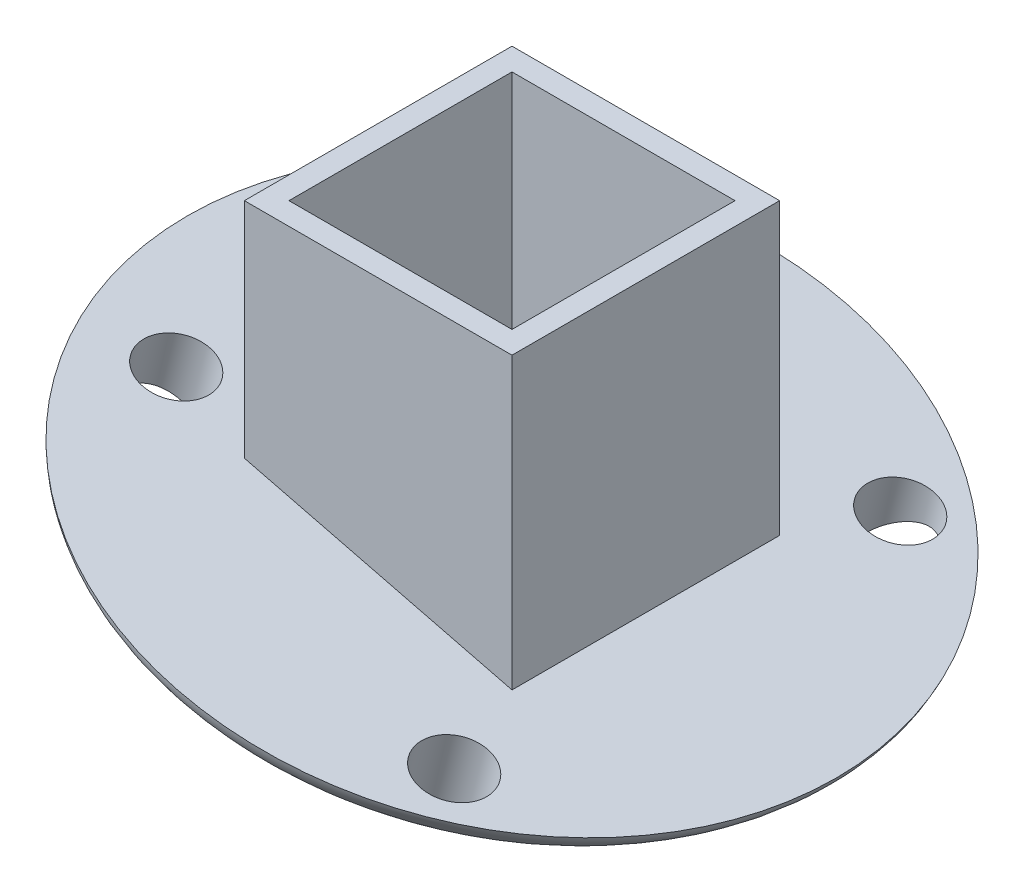
ISO-10303-21;
HEADER;
FILE_DESCRIPTION(('STEP AP214'),'2;1');
FILE_NAME('part.step','',(''),(''),'','','');
FILE_SCHEMA(('AUTOMOTIVE_DESIGN { 1 0 10303 214 1 1 1 1 }'));
ENDSEC;
DATA;
#1=APPLICATION_CONTEXT('core data for automotive mechanical design processes');
#2=APPLICATION_PROTOCOL_DEFINITION('international standard','automotive_design',2000,#1);
#3=PRODUCT_CONTEXT('',#1,'mechanical');
#4=PRODUCT('Part','Part','',(#3));
#5=PRODUCT_RELATED_PRODUCT_CATEGORY('part','',(#4));
#6=PRODUCT_DEFINITION_FORMATION('','',#4);
#7=PRODUCT_DEFINITION_CONTEXT('part definition',#1,'design');
#8=PRODUCT_DEFINITION('design','',#6,#7);
#9=PRODUCT_DEFINITION_SHAPE('','',#8);
#10=(LENGTH_UNIT() NAMED_UNIT(*) SI_UNIT(.MILLI.,.METRE.));
#11=(NAMED_UNIT(*) PLANE_ANGLE_UNIT() SI_UNIT($,.RADIAN.));
#12=(NAMED_UNIT(*) SI_UNIT($,.STERADIAN.) SOLID_ANGLE_UNIT());
#13=UNCERTAINTY_MEASURE_WITH_UNIT(LENGTH_MEASURE(1.E-05),#10,'distance_accuracy_value','');
#14=(GEOMETRIC_REPRESENTATION_CONTEXT(3) GLOBAL_UNCERTAINTY_ASSIGNED_CONTEXT((#13)) GLOBAL_UNIT_ASSIGNED_CONTEXT((#10,
#11,#12)) REPRESENTATION_CONTEXT('',''));
#15=CARTESIAN_POINT('',(0.,0.,0.));
#16=DIRECTION('',(0.,0.,1.));
#17=DIRECTION('',(1.,0.,0.));
#18=AXIS2_PLACEMENT_3D('',#15,#16,#17);
#19=CARTESIAN_POINT('',(-6.,10.,-6.));
#20=DIRECTION('',(0.,0.,1.));
#21=DIRECTION('',(1.,0.,0.));
#22=AXIS2_PLACEMENT_3D('',#19,#20,#21);
#23=PLANE('',#22);
#24=DIRECTION('',(0.970142500145332,-0.242535625036333,0.));
#25=VECTOR('',#24,1.);
#26=CARTESIAN_POINT('',(-0.352941176470588,-1.41176470588235,-6.));
#27=LINE('',#26,#25);
#28=CARTESIAN_POINT('',(-6.,0.,-6.));
#29=VERTEX_POINT('',#28);
#30=CARTESIAN_POINT('',(6.,-3.,-6.));
#31=VERTEX_POINT('',#30);
#32=EDGE_CURVE('E297',#29,#31,#27,.T.);
#33=ORIENTED_EDGE('',*,*,#32,.F.);
#34=DIRECTION('',(0.,-1.,0.));
#35=VECTOR('',#34,1.);
#36=CARTESIAN_POINT('',(-6.,10.,-6.));
#37=LINE('',#36,#35);
#38=CARTESIAN_POINT('',(-6.,10.,-6.));
#39=VERTEX_POINT('',#38);
#40=EDGE_CURVE('E56',#39,#29,#37,.T.);
#41=ORIENTED_EDGE('',*,*,#40,.F.);
#42=DIRECTION('',(-1.,0.,0.));
#43=VECTOR('',#42,1.);
#44=CARTESIAN_POINT('',(-6.,10.,-6.));
#45=LINE('',#44,#43);
#46=CARTESIAN_POINT('',(6.,10.,-6.));
#47=VERTEX_POINT('',#46);
#48=EDGE_CURVE('E207',#47,#39,#45,.T.);
#49=ORIENTED_EDGE('',*,*,#48,.F.);
#50=DIRECTION('',(0.,-1.,0.));
#51=VECTOR('',#50,1.);
#52=CARTESIAN_POINT('',(6.,10.,-6.));
#53=LINE('',#52,#51);
#54=EDGE_CURVE('E11',#47,#31,#53,.T.);
#55=ORIENTED_EDGE('',*,*,#54,.T.);
#56=EDGE_LOOP('',(#33,#41,#49,#55));
#57=FACE_BOUND('',#56,.T.);
#58=ADVANCED_FACE('F41',(#57),#23,.F.);
#59=CARTESIAN_POINT('',(-6.,10.,-6.));
#60=DIRECTION('',(1.,0.,0.));
#61=DIRECTION('',(0.,0.,-1.));
#62=AXIS2_PLACEMENT_3D('',#59,#60,#61);
#63=PLANE('',#62);
#64=DIRECTION('',(0.,0.,1.));
#65=VECTOR('',#64,1.);
#66=CARTESIAN_POINT('',(-6.,0.,-6.));
#67=LINE('',#66,#65);
#68=CARTESIAN_POINT('',(-6.,0.,6.));
#69=VERTEX_POINT('',#68);
#70=EDGE_CURVE('E300',#29,#69,#67,.T.);
#71=ORIENTED_EDGE('',*,*,#70,.T.);
#72=DIRECTION('',(0.,-1.,0.));
#73=VECTOR('',#72,1.);
#74=CARTESIAN_POINT('',(-6.,10.,6.));
#75=LINE('',#74,#73);
#76=CARTESIAN_POINT('',(-6.,10.,6.));
#77=VERTEX_POINT('',#76);
#78=EDGE_CURVE('E219',#77,#69,#75,.T.);
#79=ORIENTED_EDGE('',*,*,#78,.F.);
#80=DIRECTION('',(0.,0.,1.));
#81=VECTOR('',#80,1.);
#82=CARTESIAN_POINT('',(-6.,10.,-6.));
#83=LINE('',#82,#81);
#84=EDGE_CURVE('E210',#39,#77,#83,.T.);
#85=ORIENTED_EDGE('',*,*,#84,.F.);
#86=ORIENTED_EDGE('',*,*,#40,.T.);
#87=EDGE_LOOP('',(#71,#79,#85,#86));
#88=FACE_BOUND('',#87,.T.);
#89=ADVANCED_FACE('F137',(#88),#63,.F.);
#90=CARTESIAN_POINT('',(-6.,10.,6.));
#91=DIRECTION('',(0.,0.,-1.));
#92=DIRECTION('',(-1.,0.,0.));
#93=AXIS2_PLACEMENT_3D('',#90,#91,#92);
#94=PLANE('',#93);
#95=DIRECTION('',(0.970142500145332,-0.242535625036333,0.));
#96=VECTOR('',#95,1.);
#97=CARTESIAN_POINT('',(-0.352941176470588,-1.41176470588235,6.));
#98=LINE('',#97,#96);
#99=CARTESIAN_POINT('',(6.,-3.,6.));
#100=VERTEX_POINT('',#99);
#101=EDGE_CURVE('E296',#69,#100,#98,.T.);
#102=ORIENTED_EDGE('',*,*,#101,.T.);
#103=DIRECTION('',(0.,-1.,0.));
#104=VECTOR('',#103,1.);
#105=CARTESIAN_POINT('',(6.,10.,6.));
#106=LINE('',#105,#104);
#107=CARTESIAN_POINT('',(6.,10.,6.));
#108=VERTEX_POINT('',#107);
#109=EDGE_CURVE('E215',#108,#100,#106,.T.);
#110=ORIENTED_EDGE('',*,*,#109,.F.);
#111=DIRECTION('',(1.,0.,0.));
#112=VECTOR('',#111,1.);
#113=CARTESIAN_POINT('',(-6.,10.,6.));
#114=LINE('',#113,#112);
#115=EDGE_CURVE('E72',#77,#108,#114,.T.);
#116=ORIENTED_EDGE('',*,*,#115,.F.);
#117=ORIENTED_EDGE('',*,*,#78,.T.);
#118=EDGE_LOOP('',(#102,#110,#116,#117));
#119=FACE_BOUND('',#118,.T.);
#120=ADVANCED_FACE('F142',(#119),#94,.F.);
#121=CARTESIAN_POINT('',(0.,10.,0.));
#122=DIRECTION('',(0.,1.,0.));
#123=DIRECTION('',(0.,0.,1.));
#124=AXIS2_PLACEMENT_3D('',#121,#122,#123);
#125=PLANE('',#124);
#126=DIRECTION('',(0.,0.,-1.));
#127=VECTOR('',#126,1.);
#128=CARTESIAN_POINT('',(6.,10.,-6.));
#129=LINE('',#128,#127);
#130=EDGE_CURVE('E204',#108,#47,#129,.T.);
#131=ORIENTED_EDGE('',*,*,#130,.T.);
#132=ORIENTED_EDGE('',*,*,#48,.T.);
#133=ORIENTED_EDGE('',*,*,#84,.T.);
#134=ORIENTED_EDGE('',*,*,#115,.T.);
#135=EDGE_LOOP('',(#131,#132,#133,#134));
#136=FACE_BOUND('',#135,.T.);
#137=DIRECTION('',(-1.,0.,0.));
#138=VECTOR('',#137,1.);
#139=CARTESIAN_POINT('',(-5.00000000000001,10.,-5.));
#140=LINE('',#139,#138);
#141=CARTESIAN_POINT('',(5.,10.,-5.));
#142=VERTEX_POINT('',#141);
#143=CARTESIAN_POINT('',(-5.00000000000001,10.,-5.));
#144=VERTEX_POINT('',#143);
#145=EDGE_CURVE('E185',#142,#144,#140,.T.);
#146=ORIENTED_EDGE('',*,*,#145,.F.);
#147=DIRECTION('',(0.,0.,-1.));
#148=VECTOR('',#147,1.);
#149=CARTESIAN_POINT('',(5.,10.,5.));
#150=LINE('',#149,#148);
#151=CARTESIAN_POINT('',(5.,10.,5.));
#152=VERTEX_POINT('',#151);
#153=EDGE_CURVE('E181',#152,#142,#150,.T.);
#154=ORIENTED_EDGE('',*,*,#153,.F.);
#155=DIRECTION('',(1.,0.,0.));
#156=VECTOR('',#155,1.);
#157=CARTESIAN_POINT('',(-5.00000000000001,10.,5.));
#158=LINE('',#157,#156);
#159=CARTESIAN_POINT('',(-5.00000000000001,10.,5.));
#160=VERTEX_POINT('',#159);
#161=EDGE_CURVE('E194',#160,#152,#158,.T.);
#162=ORIENTED_EDGE('',*,*,#161,.F.);
#163=DIRECTION('',(0.,0.,1.));
#164=VECTOR('',#163,1.);
#165=CARTESIAN_POINT('',(-5.00000000000001,10.,5.));
#166=LINE('',#165,#164);
#167=EDGE_CURVE('E313',#144,#160,#166,.T.);
#168=ORIENTED_EDGE('',*,*,#167,.F.);
#169=EDGE_LOOP('',(#146,#154,#162,#168));
#170=FACE_BOUND('',#169,.T.);
#171=ADVANCED_FACE('F149',(#136,#170),#125,.T.);
#172=CARTESIAN_POINT('',(6.,10.,-6.));
#173=DIRECTION('',(-1.,0.,0.));
#174=DIRECTION('',(0.,0.,1.));
#175=AXIS2_PLACEMENT_3D('',#172,#173,#174);
#176=PLANE('',#175);
#177=ORIENTED_EDGE('',*,*,#109,.T.);
#178=DIRECTION('',(0.,0.,-1.));
#179=VECTOR('',#178,1.);
#180=CARTESIAN_POINT('',(6.,-3.,-6.));
#181=LINE('',#180,#179);
#182=EDGE_CURVE('E307',#100,#31,#181,.T.);
#183=ORIENTED_EDGE('',*,*,#182,.T.);
#184=ORIENTED_EDGE('',*,*,#54,.F.);
#185=ORIENTED_EDGE('',*,*,#130,.F.);
#186=EDGE_LOOP('',(#177,#183,#184,#185));
#187=FACE_BOUND('',#186,.T.);
#188=ADVANCED_FACE('F43',(#187),#176,.F.);
#189=CARTESIAN_POINT('',(5.,10.,5.));
#190=DIRECTION('',(-1.,0.,0.));
#191=DIRECTION('',(0.,0.,1.));
#192=AXIS2_PLACEMENT_3D('',#189,#190,#191);
#193=PLANE('',#192);
#194=DIRECTION('',(0.,0.,-1.));
#195=VECTOR('',#194,1.);
#196=CARTESIAN_POINT('',(5.,0.,5.));
#197=LINE('',#196,#195);
#198=CARTESIAN_POINT('',(5.,0.,5.));
#199=VERTEX_POINT('',#198);
#200=CARTESIAN_POINT('',(5.,0.,-5.));
#201=VERTEX_POINT('',#200);
#202=EDGE_CURVE('E177',#199,#201,#197,.T.);
#203=ORIENTED_EDGE('',*,*,#202,.F.);
#204=DIRECTION('',(0.,-1.,0.));
#205=VECTOR('',#204,1.);
#206=CARTESIAN_POINT('',(5.,10.,5.));
#207=LINE('',#206,#205);
#208=EDGE_CURVE('E191',#152,#199,#207,.T.);
#209=ORIENTED_EDGE('',*,*,#208,.F.);
#210=ORIENTED_EDGE('',*,*,#153,.T.);
#211=DIRECTION('',(0.,-1.,0.));
#212=VECTOR('',#211,1.);
#213=CARTESIAN_POINT('',(5.,10.,-5.));
#214=LINE('',#213,#212);
#215=EDGE_CURVE('E200',#142,#201,#214,.T.);
#216=ORIENTED_EDGE('',*,*,#215,.T.);
#217=EDGE_LOOP('',(#203,#209,#210,#216));
#218=FACE_BOUND('',#217,.T.);
#219=ADVANCED_FACE('F153',(#218),#193,.T.);
#220=CARTESIAN_POINT('',(-5.00000000000001,10.,-5.));
#221=DIRECTION('',(0.,0.,1.));
#222=DIRECTION('',(1.,0.,0.));
#223=AXIS2_PLACEMENT_3D('',#220,#221,#222);
#224=PLANE('',#223);
#225=DIRECTION('',(-1.,0.,0.));
#226=VECTOR('',#225,1.);
#227=CARTESIAN_POINT('',(-5.00000000000001,0.,-5.));
#228=LINE('',#227,#226);
#229=CARTESIAN_POINT('',(-5.00000000000001,0.,-5.));
#230=VERTEX_POINT('',#229);
#231=EDGE_CURVE('E187',#201,#230,#228,.T.);
#232=ORIENTED_EDGE('',*,*,#231,.F.);
#233=ORIENTED_EDGE('',*,*,#215,.F.);
#234=ORIENTED_EDGE('',*,*,#145,.T.);
#235=DIRECTION('',(0.,-1.,0.));
#236=VECTOR('',#235,1.);
#237=CARTESIAN_POINT('',(-5.00000000000001,10.,-5.));
#238=LINE('',#237,#236);
#239=EDGE_CURVE('E197',#144,#230,#238,.T.);
#240=ORIENTED_EDGE('',*,*,#239,.T.);
#241=EDGE_LOOP('',(#232,#233,#234,#240));
#242=FACE_BOUND('',#241,.T.);
#243=ADVANCED_FACE('F156',(#242),#224,.T.);
#244=CARTESIAN_POINT('',(-5.00000000000001,10.,5.));
#245=DIRECTION('',(1.,0.,0.));
#246=DIRECTION('',(0.,0.,-1.));
#247=AXIS2_PLACEMENT_3D('',#244,#245,#246);
#248=PLANE('',#247);
#249=DIRECTION('',(0.,0.,1.));
#250=VECTOR('',#249,1.);
#251=CARTESIAN_POINT('',(-5.00000000000001,0.,5.));
#252=LINE('',#251,#250);
#253=CARTESIAN_POINT('',(-5.00000000000001,0.,5.));
#254=VERTEX_POINT('',#253);
#255=EDGE_CURVE('E179',#230,#254,#252,.T.);
#256=ORIENTED_EDGE('',*,*,#255,.F.);
#257=ORIENTED_EDGE('',*,*,#239,.F.);
#258=ORIENTED_EDGE('',*,*,#167,.T.);
#259=DIRECTION('',(0.,-1.,0.));
#260=VECTOR('',#259,1.);
#261=CARTESIAN_POINT('',(-5.00000000000001,10.,5.));
#262=LINE('',#261,#260);
#263=EDGE_CURVE('E64',#160,#254,#262,.T.);
#264=ORIENTED_EDGE('',*,*,#263,.T.);
#265=EDGE_LOOP('',(#256,#257,#258,#264));
#266=FACE_BOUND('',#265,.T.);
#267=ADVANCED_FACE('F160',(#266),#248,.T.);
#268=CARTESIAN_POINT('',(-5.00000000000001,10.,5.));
#269=DIRECTION('',(0.,0.,-1.));
#270=DIRECTION('',(-1.,0.,0.));
#271=AXIS2_PLACEMENT_3D('',#268,#269,#270);
#272=PLANE('',#271);
#273=DIRECTION('',(1.,0.,0.));
#274=VECTOR('',#273,1.);
#275=CARTESIAN_POINT('',(-5.00000000000001,0.,5.));
#276=LINE('',#275,#274);
#277=EDGE_CURVE('E174',#254,#199,#276,.T.);
#278=ORIENTED_EDGE('',*,*,#277,.F.);
#279=ORIENTED_EDGE('',*,*,#263,.F.);
#280=ORIENTED_EDGE('',*,*,#161,.T.);
#281=ORIENTED_EDGE('',*,*,#208,.T.);
#282=EDGE_LOOP('',(#278,#279,#280,#281));
#283=FACE_BOUND('',#282,.T.);
#284=ADVANCED_FACE('F164',(#283),#272,.T.);
#285=CARTESIAN_POINT('',(-6.,0.,6.));
#286=DIRECTION('',(0.,1.,0.));
#287=DIRECTION('',(0.,0.,1.));
#288=AXIS2_PLACEMENT_3D('',#285,#286,#287);
#289=PLANE('',#288);
#290=ORIENTED_EDGE('',*,*,#277,.T.);
#291=ORIENTED_EDGE('',*,*,#202,.T.);
#292=ORIENTED_EDGE('',*,*,#231,.T.);
#293=ORIENTED_EDGE('',*,*,#255,.T.);
#294=EDGE_LOOP('',(#290,#291,#292,#293));
#295=FACE_BOUND('',#294,.T.);
#296=ADVANCED_FACE('F128',(#295),#289,.T.);
#297=CARTESIAN_POINT('',(-0.352941176470588,-1.41176470588235,0.));
#298=DIRECTION('',(0.242535625036333,0.970142500145332,0.));
#299=DIRECTION('',(-0.970142500145332,0.242535625036333,0.));
#300=AXIS2_PLACEMENT_3D('',#297,#298,#299);
#301=PLANE('',#300);
#302=CARTESIAN_POINT('',(-10.0543661779239,1.01359154448097,5.));
#303=DIRECTION('',(0.242535625036333,0.970142500145332,0.));
#304=DIRECTION('',(-0.970142500145332,0.242535625036333,0.));
#305=AXIS2_PLACEMENT_3D('',#302,#303,#304);
#306=CIRCLE('',#305,1.5);
#307=CARTESIAN_POINT('',(-11.5095799281419,1.37739498203547,5.));
#308=VERTEX_POINT('',#307);
#309=EDGE_CURVE('E281',#308,#308,#306,.T.);
#310=ORIENTED_EDGE('',*,*,#309,.F.);
#311=EDGE_LOOP('',(#310));
#312=FACE_BOUND('',#311,.T.);
#313=CARTESIAN_POINT('',(7.40819882469207,-3.35204970617302,10.));
#314=DIRECTION('',(0.242535625036333,0.970142500145332,0.));
#315=DIRECTION('',(-0.970142500145332,0.242535625036333,0.));
#316=AXIS2_PLACEMENT_3D('',#313,#314,#315);
#317=CIRCLE('',#316,1.5);
#318=CARTESIAN_POINT('',(5.95298507447407,-2.98824626861852,10.));
#319=VERTEX_POINT('',#318);
#320=EDGE_CURVE('E274',#319,#319,#317,.T.);
#321=ORIENTED_EDGE('',*,*,#320,.F.);
#322=EDGE_LOOP('',(#321));
#323=FACE_BOUND('',#322,.T.);
#324=CARTESIAN_POINT('',(7.40819882469207,-3.35204970617302,-10.));
#325=DIRECTION('',(0.242535625036333,0.970142500145332,0.));
#326=DIRECTION('',(-0.970142500145332,0.242535625036333,0.));
#327=AXIS2_PLACEMENT_3D('',#324,#325,#326);
#328=CIRCLE('',#327,1.5);
#329=CARTESIAN_POINT('',(5.95298507447407,-2.98824626861852,-10.));
#330=VERTEX_POINT('',#329);
#331=EDGE_CURVE('E271',#330,#330,#328,.T.);
#332=ORIENTED_EDGE('',*,*,#331,.F.);
#333=EDGE_LOOP('',(#332));
#334=FACE_BOUND('',#333,.T.);
#335=CARTESIAN_POINT('',(-10.0543661779239,1.01359154448097,-5.));
#336=DIRECTION('',(0.242535625036333,0.970142500145332,0.));
#337=DIRECTION('',(-0.970142500145332,0.242535625036333,0.));
#338=AXIS2_PLACEMENT_3D('',#335,#336,#337);
#339=CIRCLE('',#338,1.5);
#340=CARTESIAN_POINT('',(-11.5095799281419,1.37739498203547,-5.));
#341=VERTEX_POINT('',#340);
#342=EDGE_CURVE('E234',#341,#341,#339,.T.);
#343=ORIENTED_EDGE('',*,*,#342,.F.);
#344=EDGE_LOOP('',(#343));
#345=FACE_BOUND('',#344,.T.);
#346=CARTESIAN_POINT('',(0.,-1.5,0.));
#347=DIRECTION('',(0.242535625036333,0.970142500145332,0.));
#348=DIRECTION('',(-0.970142500145332,0.242535625036333,0.));
#349=AXIS2_PLACEMENT_3D('',#346,#347,#348);
#350=CIRCLE('',#349,15.);
#351=CARTESIAN_POINT('',(-14.55213750218,2.13803437554499,0.));
#352=VERTEX_POINT('',#351);
#353=EDGE_CURVE('E259',#352,#352,#350,.T.);
#354=ORIENTED_EDGE('',*,*,#353,.T.);
#355=EDGE_LOOP('',(#354));
#356=FACE_BOUND('',#355,.T.);
#357=ORIENTED_EDGE('',*,*,#32,.T.);
#358=ORIENTED_EDGE('',*,*,#182,.F.);
#359=ORIENTED_EDGE('',*,*,#101,.F.);
#360=ORIENTED_EDGE('',*,*,#70,.F.);
#361=EDGE_LOOP('',(#357,#358,#359,#360));
#362=FACE_BOUND('',#361,.T.);
#363=ADVANCED_FACE('F119',(#312,#323,#334,#345,#356,#362),#301,.T.);
#364=CARTESIAN_POINT('',(-1.21267812518167,-6.35071250072666,0.));
#365=CARTESIAN_POINT('',(4.87585189508166,-8.18182814171305,0.));
#366=CARTESIAN_POINT('',(13.570451870267,-7.28992498295824,0.));
#367=CARTESIAN_POINT('',(14.55213750218,-5.13803437554499,0.));
#368=B_SPLINE_CURVE_WITH_KNOTS('',3,(#364,#365,#366,#367),.UNSPECIFIED.,.F.,.F.,(4,4),(0.,1.),.UNSPECIFIED.);
#369=CARTESIAN_POINT('',(0.,-1.5,0.));
#370=DIRECTION('',(0.242535625036333,0.970142500145332,0.));
#371=AXIS1_PLACEMENT('',#369,#370);
#372=SURFACE_OF_REVOLUTION('',#368,#371);
#373=CARTESIAN_POINT('',(-12.0197971199061,-0.663473785021444,5.));
#374=CARTESIAN_POINT('',(-12.0157409134766,-0.647255514687904,5.0754276182354));
#375=CARTESIAN_POINT('',(-12.0067309112504,-0.634737017285245,5.15141320809814));
#376=CARTESIAN_POINT('',(-11.9786925911136,-0.617917156391617,5.30247510571023));
#377=CARTESIAN_POINT('',(-11.959662666126,-0.613617111555374,5.37755126562121));
#378=CARTESIAN_POINT('',(-11.9118599324409,-0.613706292625446,5.52469897103323));
#379=CARTESIAN_POINT('',(-11.8830695737425,-0.61811124015603,5.59676483976878));
#380=CARTESIAN_POINT('',(-11.8165622331768,-0.635623656224439,5.73550893605356));
#381=CARTESIAN_POINT('',(-11.7788463553641,-0.648730048786384,5.80218782858519));
#382=CARTESIAN_POINT('',(-11.6970137588876,-0.68255874924934,5.92624572134935));
#383=CARTESIAN_POINT('',(-11.6531334456891,-0.703030696672179,5.98384996156558));
#384=CARTESIAN_POINT('',(-11.5594734782035,-0.750758344724975,6.09084693530998));
#385=CARTESIAN_POINT('',(-11.5096929928724,-0.778015001582919,6.14023850971779));
#386=CARTESIAN_POINT('',(-11.4035186670139,-0.839456002781774,6.2317280988319));
#387=CARTESIAN_POINT('',(-11.3469389565921,-0.873875629196584,6.27345109966863));
#388=CARTESIAN_POINT('',(-11.2303904668409,-0.947624818698004,6.34650492298712));
#389=CARTESIAN_POINT('',(-11.1704205262161,-0.986956069867339,6.37783215893063));
#390=CARTESIAN_POINT('',(-11.042717741358,-1.07318748532655,6.43233157230094));
#391=CARTESIAN_POINT('',(-10.9747853725382,-1.12045161083837,6.45445919249957));
#392=CARTESIAN_POINT('',(-10.8380051593135,-1.2180238835639,6.48607584578689));
#393=CARTESIAN_POINT('',(-10.7691557268284,-1.26833805826586,6.49553893987472));
#394=CARTESIAN_POINT('',(-10.6252802826567,-1.37574907488373,6.50229054453039));
#395=CARTESIAN_POINT('',(-10.5503229945923,-1.43302195285605,6.49827088909063));
#396=CARTESIAN_POINT('',(-10.4031543969174,-1.54795271033081,6.47559350450102));
#397=CARTESIAN_POINT('',(-10.3309397306771,-1.60561001055235,6.45695431565466));
#398=CARTESIAN_POINT('',(-10.1863538506627,-1.72367928336796,6.40399505335354));
#399=CARTESIAN_POINT('',(-10.1142717682697,-1.78402967796606,6.36874285152198));
#400=CARTESIAN_POINT('',(-9.97712355771016,-1.90205293983172,6.28324172550525));
#401=CARTESIAN_POINT('',(-9.91205850914628,-1.95972539431094,6.23299049811984));
#402=CARTESIAN_POINT('',(-9.79062070450129,-2.07116963930879,6.11825968134843));
#403=CARTESIAN_POINT('',(-9.73430994639105,-2.12491229636856,6.05368582994542));
#404=CARTESIAN_POINT('',(-9.63306491747079,-2.22639537260772,5.91206721404537));
#405=CARTESIAN_POINT('',(-9.58812839420328,-2.27413697924033,5.83502492365465));
#406=CARTESIAN_POINT('',(-9.51352198334025,-2.3598493667483,5.67445471725674));
#407=CARTESIAN_POINT('',(-9.4832293561614,-2.39817605067882,5.59140739391477));
#408=CARTESIAN_POINT('',(-9.43650041048285,-2.46639985705878,5.41823637867144));
#409=CARTESIAN_POINT('',(-9.42005680907142,-2.49630140459791,5.32811643340675));
#410=CARTESIAN_POINT('',(-9.40299933024736,-2.54437772891947,5.15103467642446));
#411=CARTESIAN_POINT('',(-9.40123975708203,-2.56329112538942,5.06438394790445));
#412=CARTESIAN_POINT('',(-9.41113271516632,-2.59199431796591,4.89033895394333));
#413=CARTESIAN_POINT('',(-9.42277798519613,-2.60178904833252,4.80294511647802));
#414=CARTESIAN_POINT('',(-9.4580745780455,-2.61135753848754,4.63694488194975));
#415=CARTESIAN_POINT('',(-9.4807578321626,-2.6118290874071,4.5581716822317));
#416=CARTESIAN_POINT('',(-9.537039345872,-2.60442052534749,4.40504808075806));
#417=CARTESIAN_POINT('',(-9.57063442229262,-2.59654284847039,4.33069639664259));
#418=CARTESIAN_POINT('',(-9.64614747732877,-2.57315973436023,4.19159312171));
#419=CARTESIAN_POINT('',(-9.68767643769283,-2.55797377358743,4.12657571428489));
#420=CARTESIAN_POINT('',(-9.7785488469761,-2.52062887177609,4.00450476349183));
#421=CARTESIAN_POINT('',(-9.82789214970185,-2.49847006118041,3.94745107117347));
#422=CARTESIAN_POINT('',(-9.93326122269951,-2.4477059266176,3.84229280242725));
#423=CARTESIAN_POINT('',(-9.98933453734701,-2.41905329294657,3.79425888616038));
#424=CARTESIAN_POINT('',(-10.1061845559403,-2.356283017037,3.708638456234));
#425=CARTESIAN_POINT('',(-10.166962098606,-2.32216439909918,3.6710538110923));
#426=CARTESIAN_POINT('',(-10.2945996845576,-2.2476327931858,3.60531170886793));
#427=CARTESIAN_POINT('',(-10.3616118573189,-2.20699295826661,3.57770794510115));
#428=CARTESIAN_POINT('',(-10.4971134767886,-2.12187573358777,3.53482697513257));
#429=CARTESIAN_POINT('',(-10.5656033573521,-2.07739720496402,3.51955344107665));
#430=CARTESIAN_POINT('',(-10.7073782568916,-1.98232578851224,3.50055404618056));
#431=CARTESIAN_POINT('',(-10.7806471050563,-1.93152367068089,3.49775581391755));
#432=CARTESIAN_POINT('',(-10.9250559486935,-1.82801694767918,3.50578934128803));
#433=CARTESIAN_POINT('',(-10.9961952082033,-1.77531169837858,3.51662575848446));
#434=CARTESIAN_POINT('',(-11.1398318178459,-1.66523584273209,3.55257053860612));
#435=CARTESIAN_POINT('',(-11.2120367626882,-1.60780976132364,3.57868029220783));
#436=CARTESIAN_POINT('',(-11.3502214787021,-1.49353358328937,3.64489196478571));
#437=CARTESIAN_POINT('',(-11.4161995778662,-1.43668364500431,3.68499762838338));
#438=CARTESIAN_POINT('',(-11.5433657640452,-1.32213598480905,3.78040329628816));
#439=CARTESIAN_POINT('',(-11.6041509544904,-1.26453734100689,3.83636123000158));
#440=CARTESIAN_POINT('',(-11.7152617790146,-1.15308011891643,3.96103438181037));
#441=CARTESIAN_POINT('',(-11.765582774208,-1.09922320639122,4.02975523239105));
#442=CARTESIAN_POINT('',(-11.8541213719783,-0.99692260110343,4.17839189327054));
#443=CARTESIAN_POINT('',(-11.892318620045,-0.948488099304994,4.25832620884064));
#444=CARTESIAN_POINT('',(-11.9548182911676,-0.859115992730395,4.42723815994336));
#445=CARTESIAN_POINT('',(-11.979142232882,-0.818166844959546,4.5162015367495));
#446=CARTESIAN_POINT('',(-12.0071840808379,-0.75733705759556,4.67130744084161));
#447=CARTESIAN_POINT('',(-12.0149910456555,-0.734893808006112,4.73573633040673));
#448=CARTESIAN_POINT('',(-12.0230953394082,-0.695155732719086,4.86663090159212));
#449=CARTESIAN_POINT('',(-12.023394961434,-0.677859336528751,4.9330959550628));
#450=CARTESIAN_POINT('',(-12.0197971199061,-0.663473785021444,5.));
#451=B_SPLINE_CURVE_WITH_KNOTS('',3,(#373,#374,#375,#376,#377,#378,#379,#380,#381,#382,#383,
#384,#385,#386,#387,#388,#389,#390,#391,#392,#393,#394,#395,#396,#397,#398,#399,#400,#401,#402,
#403,#404,#405,#406,#407,#408,#409,#410,#411,#412,#413,#414,#415,#416,#417,#418,#419,#420,#421,
#422,#423,#424,#425,#426,#427,#428,#429,#430,#431,#432,#433,#434,#435,#436,#437,#438,#439,#440,
#441,#442,#443,#444,#445,#446,#447,#448,#449,#450),.UNSPECIFIED.,.T.,.F.,(4,2,2,2,2,2,2,2,2,2,2,
2,2,2,2,2,2,2,2,2,2,2,2,2,2,2,2,2,2,2,2,2,2,2,2,2,2,2,4),(0.,0.231547584449609,
0.463132317704215,0.695135686094482,0.927110371484952,1.15184784186888,1.37661700440684,
1.61046164393925,1.84438687618594,2.10032063516533,2.35677778977975,2.63880912157847,
2.92048336205538,3.22028857585768,3.52013985045153,3.82202641187523,4.12385314337645,
4.41137157016094,4.69873870246738,4.96345220773359,5.22802238877313,5.47270921849306,
5.71732473274655,5.95210345057304,6.18687777659585,6.42342087057007,6.66000623554259,
6.90821171010104,7.15649107710423,7.42295349312056,7.68950695676426,7.97588234196553,
8.26233440604109,8.56307007144251,8.86393877318314,9.16530996253603,9.46621241976974,
9.67165710534837,9.87703903782261),.UNSPECIFIED.);
#452=CARTESIAN_POINT('',(-12.0197971199061,-0.663473785021444,5.));
#453=VERTEX_POINT('',#452);
#454=EDGE_CURVE('E45',#453,#453,#451,.T.);
#455=ORIENTED_EDGE('',*,*,#454,.T.);
#456=EDGE_LOOP('',(#455));
#457=FACE_BOUND('',#456,.T.);
#458=CARTESIAN_POINT('',(5.30148344093883,-5.59425280275948,10.));
#459=CARTESIAN_POINT('',(5.31026423610923,-5.55914676561249,10.0923927940984));
#460=CARTESIAN_POINT('',(5.32795651066028,-5.5236632524339,10.1838431800947));
#461=CARTESIAN_POINT('',(5.37965876674857,-5.4527619879642,10.3620617921046));
#462=CARTESIAN_POINT('',(5.41368902415863,-5.41734437343101,10.4488240507742));
#463=CARTESIAN_POINT('',(5.4962188410673,-5.34736514484646,10.6150950334992));
#464=CARTESIAN_POINT('',(5.54466328497647,-5.31280080375585,10.6946299072738));
#465=CARTESIAN_POINT('',(5.62680455886278,-5.26195976988359,10.8072993937752));
#466=CARTESIAN_POINT('',(5.65576608130124,-5.24517937389646,10.8437523816326));
#467=CARTESIAN_POINT('',(5.71667155048586,-5.21198840052297,10.9143222218084));
#468=CARTESIAN_POINT('',(5.74861821225423,-5.19557817698514,10.9484368975521));
#469=CARTESIAN_POINT('',(5.8535420977283,-5.14461229045963,11.0518265474341));
#470=CARTESIAN_POINT('',(5.93152790526793,-5.11084784731399,11.1165165386776));
#471=CARTESIAN_POINT('',(6.09800715764533,-5.04609463743659,11.2323632809702));
#472=CARTESIAN_POINT('',(6.1865017286016,-5.01510616880345,11.2835185797428));
#473=CARTESIAN_POINT('',(6.32697789525901,-4.97086781976059,11.3496637118869));
#474=CARTESIAN_POINT('',(6.37598803429697,-4.95627011483396,11.3701976501815));
#475=CARTESIAN_POINT('',(6.47584240076422,-4.92821789844827,11.4069934431215));
#476=CARTESIAN_POINT('',(6.52668500051323,-4.91476240641423,11.4232589877411));
#477=CARTESIAN_POINT('',(6.68151795196147,-4.8763530370568,11.4653220960905));
#478=CARTESIAN_POINT('',(6.78794112671971,-4.85331570711899,11.4844466845421));
#479=CARTESIAN_POINT('',(6.98004969957128,-4.81861752323564,11.5008653120616));
#480=CARTESIAN_POINT('',(7.0651755030519,-4.80557026363213,11.5020214492378));
#481=CARTESIAN_POINT('',(7.23529365075405,-4.7850252912631,11.4913342365451));
#482=CARTESIAN_POINT('',(7.32028602585277,-4.77752046524843,11.4795075976501));
#483=CARTESIAN_POINT('',(7.47475148921952,-4.77008809315167,11.444990728683));
#484=CARTESIAN_POINT('',(7.54460855574836,-4.76917645791952,11.424240700663));
#485=CARTESIAN_POINT('',(7.68038749383489,-4.77316267741675,11.3727697978511));
#486=CARTESIAN_POINT('',(7.74631198001544,-4.77805662598255,11.342055637311));
#487=CARTESIAN_POINT('',(7.87227115591693,-4.79417127301392,11.2709395658957));
#488=CARTESIAN_POINT('',(7.93228002734001,-4.80541837773716,11.2304976279311));
#489=CARTESIAN_POINT('',(8.04395657826645,-4.83411730716146,11.1411799203806));
#490=CARTESIAN_POINT('',(8.09562473578067,-4.85156877610334,11.0923046344469));
#491=CARTESIAN_POINT('',(8.18587273674372,-4.89042294962269,10.9915382576008));
#492=CARTESIAN_POINT('',(8.22511408549756,-4.91146519188401,10.9400952405687));
#493=CARTESIAN_POINT('',(8.29465849666164,-4.95721688626278,10.8328695761488));
#494=CARTESIAN_POINT('',(8.32494525058309,-4.98193290773898,10.777079241816));
#495=CARTESIAN_POINT('',(8.37850246085231,-5.03597280958686,10.6581346824298));
#496=CARTESIAN_POINT('',(8.40103572417515,-5.06550608691895,10.5947461597808));
#497=CARTESIAN_POINT('',(8.4359494732796,-5.12631380933036,10.4661487030535));
#498=CARTESIAN_POINT('',(8.44833593691982,-5.15758721761825,10.4009408642532));
#499=CARTESIAN_POINT('',(8.46482044100663,-5.22639834507116,10.2584572103039));
#500=CARTESIAN_POINT('',(8.46711525591382,-5.26408431013015,10.1810440844943));
#501=CARTESIAN_POINT('',(8.45935942825199,-5.33930725474097,10.0267828861899));
#502=CARTESIAN_POINT('',(8.44930115542595,-5.37684412782834,9.94993519245804));
#503=CARTESIAN_POINT('',(8.41503663150783,-5.45684534302839,9.7858417919946));
#504=CARTESIAN_POINT('',(8.38880950513861,-5.49912753411505,9.69891894468462));
#505=CARTESIAN_POINT('',(8.33863895099516,-5.5606043642829,9.57200675884807));
#506=CARTESIAN_POINT('',(8.32010190933842,-5.58077908006724,9.5302671097775));
#507=CARTESIAN_POINT('',(8.27952323179509,-5.62040590536004,9.44810777887808));
#508=CARTESIAN_POINT('',(8.25747806626324,-5.63985726249303,9.40768947640577));
#509=CARTESIAN_POINT('',(8.18210679071244,-5.70029478624758,9.28184297590067));
#510=CARTESIAN_POINT('',(8.12246746049029,-5.73972251311795,9.19934474814601));
#511=CARTESIAN_POINT('',(7.98871482496629,-5.8135931655576,9.0444544759557));
#512=CARTESIAN_POINT('',(7.91460326421191,-5.84803669107443,8.97206121522394));
#513=CARTESIAN_POINT('',(7.7938708665128,-5.89535683381525,8.87293922557452));
#514=CARTESIAN_POINT('',(7.75194938584213,-5.91042895108319,8.8414289573473));
#515=CARTESIAN_POINT('',(7.66522397557944,-5.93899740796352,8.78195447088212));
#516=CARTESIAN_POINT('',(7.62042274512802,-5.9524951907086,8.75398700303644));
#517=CARTESIAN_POINT('',(7.48203766337173,-5.9904957496605,8.67586635467705));
#518=CARTESIAN_POINT('',(7.38440398806403,-6.01253255587251,8.63143832388434));
#519=CARTESIAN_POINT('',(7.18854814745865,-6.04790156977392,8.56316750481872));
#520=CARTESIAN_POINT('',(7.09083674518569,-6.06173161276168,8.53811040553443));
#521=CARTESIAN_POINT('',(6.89177404808455,-6.08241866767947,8.50564613007618));
#522=CARTESIAN_POINT('',(6.79042568761627,-6.08928117575781,8.49822503601923));
#523=CARTESIAN_POINT('',(6.59878041758476,-6.09529778421929,8.50226800823494));
#524=CARTESIAN_POINT('',(6.50846591562359,-6.09520078721827,8.51178891786733));
#525=CARTESIAN_POINT('',(6.33111853126918,-6.08902952428063,8.54653209281453));
#526=CARTESIAN_POINT('',(6.24408315451947,-6.08295990095862,8.57174215711304));
#527=CARTESIAN_POINT('',(6.08510488058326,-6.06588888682034,8.63420397589673));
#528=CARTESIAN_POINT('',(6.01252426952465,-6.05544444657757,8.66999090359044));
#529=CARTESIAN_POINT('',(5.87516285469264,-6.03012857542113,8.75309297699762));
#530=CARTESIAN_POINT('',(5.81037888789951,-6.01525894832135,8.8004034240203));
#531=CARTESIAN_POINT('',(5.69400214577234,-5.9824945132098,8.90218565051016));
#532=CARTESIAN_POINT('',(5.64188139540376,-5.96480986932014,8.95612362958487));
#533=CARTESIAN_POINT('',(5.54785109799789,-5.92642736407016,9.0713221181861));
#534=CARTESIAN_POINT('',(5.50594183605565,-5.90572941860711,9.13258283208526));
#535=CARTESIAN_POINT('',(5.43301279463439,-5.86177162880661,9.2609349200492));
#536=CARTESIAN_POINT('',(5.40205912635425,-5.83849730746849,9.32805874386482));
#537=CARTESIAN_POINT('',(5.35179281372085,-5.7900900664333,9.46586264248127));
#538=CARTESIAN_POINT('',(5.33247840898824,-5.76495742844302,9.53654217774593));
#539=CARTESIAN_POINT('',(5.30673064576553,-5.71584093696016,9.67281854185036));
#540=CARTESIAN_POINT('',(5.29925197302786,-5.69197317401981,9.73826401802716));
#541=CARTESIAN_POINT('',(5.29353276625174,-5.64355050176232,9.86929568355395));
#542=CARTESIAN_POINT('',(5.29529476956532,-5.61899540555489,9.93488190660877));
#543=CARTESIAN_POINT('',(5.30148344093883,-5.59425280275948,10.));
#544=B_SPLINE_CURVE_WITH_KNOTS('',3,(#458,#459,#460,#461,#462,#463,#464,#465,#466,#467,#468,
#469,#470,#471,#472,#473,#474,#475,#476,#477,#478,#479,#480,#481,#482,#483,#484,#485,#486,#487,
#488,#489,#490,#491,#492,#493,#494,#495,#496,#497,#498,#499,#500,#501,#502,#503,#504,#505,#506,
#507,#508,#509,#510,#511,#512,#513,#514,#515,#516,#517,#518,#519,#520,#521,#522,#523,#524,#525,
#526,#527,#528,#529,#530,#531,#532,#533,#534,#535,#536,#537,#538,#539,#540,#541,#542,#543),
.UNSPECIFIED.,.T.,.F.,(4,2,2,2,2,2,2,2,2,2,2,2,2,2,2,2,2,2,2,2,2,2,2,2,2,2,2,2,2,2,2,2,2,2,2,2,
2,2,2,2,2,2,4),(0.,0.297403437305341,0.595176918039774,0.89182612146196,1.04016830056716,
1.1886467369598,1.50754104906942,1.82646956476569,1.99160072311174,2.15658865377774,
2.48612933544201,2.74353875866259,3.0006172415907,3.21834101208679,3.43591837482231,
3.65440680152527,3.8728827020889,4.07612123801764,4.27972767222263,4.499313390737,
4.71876964987872,4.97616764688556,5.23372471351662,5.53283753258797,5.68250074685679,
5.8323155057914,6.15820480352914,6.48405484133479,6.6475628377843,6.81091975470981,
7.13735921836315,7.44115110520486,7.74470316755114,8.01564511930923,8.28637662994088,
8.52989948172149,8.77332320330874,9.00342142055317,9.23352606118499,9.46499649206783,
9.69643190543422,9.90598318555211,10.115592008343),.UNSPECIFIED.);
#545=CARTESIAN_POINT('',(5.30148344093883,-5.59425280275948,10.));
#546=VERTEX_POINT('',#545);
#547=EDGE_CURVE('E250',#546,#546,#544,.T.);
#548=ORIENTED_EDGE('',*,*,#547,.T.);
#549=EDGE_LOOP('',(#548));
#550=FACE_BOUND('',#549,.T.);
#551=CARTESIAN_POINT('',(5.30148344093883,-5.59425280275948,-10.));
#552=CARTESIAN_POINT('',(5.29388079603943,-5.62467035844214,-9.91994507414296));
#553=CARTESIAN_POINT('',(5.29295521518606,-5.65483852620951,-9.83909433653738));
#554=CARTESIAN_POINT('',(5.30524524691957,-5.71399558858934,-9.67805769330075));
#555=CARTESIAN_POINT('',(5.31844797186018,-5.7429855329426,-9.59787124889569));
#556=CARTESIAN_POINT('',(5.34910378266985,-5.78509342042559,-9.47976547651785));
#557=CARTESIAN_POINT('',(5.36117947457055,-5.79893615933055,-9.44065429719757));
#558=CARTESIAN_POINT('',(5.38894124499975,-5.82603377462657,-9.36356187471479));
#559=CARTESIAN_POINT('',(5.40462480193311,-5.83928905392146,-9.32557986319811));
#560=CARTESIAN_POINT('',(5.45705826479981,-5.87803211212015,-9.21379474434205));
#561=CARTESIAN_POINT('',(5.49921003399645,-5.90252357548275,-9.14207815091258));
#562=CARTESIAN_POINT('',(5.59367648365867,-5.94644808591666,-9.0115559950147));
#563=CARTESIAN_POINT('',(5.64515126043405,-5.96610660001895,-8.95221393807176));
#564=CARTESIAN_POINT('',(5.75835505119243,-6.00168467749475,-8.84293074460444));
#565=CARTESIAN_POINT('',(5.82008065112964,-6.01760548146905,-8.79298648990737));
#566=CARTESIAN_POINT('',(5.94857822566134,-6.04451993161716,-8.70629200807791));
#567=CARTESIAN_POINT('',(6.01495299969222,-6.05571730529925,-8.66901390172901));
#568=CARTESIAN_POINT('',(6.15322929590785,-6.07398247564174,-8.60529769869009));
#569=CARTESIAN_POINT('',(6.22513067727308,-6.08105037748281,-8.57885932590924));
#570=CARTESIAN_POINT('',(6.37309289797773,-6.09095985794535,-8.53703162055205));
#571=CARTESIAN_POINT('',(6.44918727170541,-6.0937598506014,-8.52175175414437));
#572=CARTESIAN_POINT('',(6.60281925105443,-6.09499985666034,-8.50260227180301));
#573=CARTESIAN_POINT('',(6.68035716269009,-6.09343893489758,-8.49873510360323));
#574=CARTESIAN_POINT('',(6.83972432469572,-6.08583778991837,-8.50208559541496));
#575=CARTESIAN_POINT('',(6.9215254269645,-6.07952897953592,-8.5099969404831));
#576=CARTESIAN_POINT('',(7.0826708400013,-6.0623485584336,-8.53735321237807));
#577=CARTESIAN_POINT('',(7.16201428316943,-6.05147535567278,-8.55680216445278));
#578=CARTESIAN_POINT('',(7.32380786675335,-6.02424242884934,-8.60849806468638));
#579=CARTESIAN_POINT('',(7.40585989587451,-6.00746626511217,-8.64176763671848));
#580=CARTESIAN_POINT('',(7.56340946647995,-5.96920810651091,-8.71940668146041));
#581=CARTESIAN_POINT('',(7.63890247116109,-5.94772289006928,-8.76378375604872));
#582=CARTESIAN_POINT('',(7.74971985358837,-5.91113208396471,-8.83996846063317));
#583=CARTESIAN_POINT('',(7.78785923646129,-5.89749406412602,-8.86847208100002));
#584=CARTESIAN_POINT('',(7.86149122563037,-5.86902194128816,-8.92809558395828));
#585=CARTESIAN_POINT('',(7.89698634542556,-5.85418900277522,-8.95921292063246));
#586=CARTESIAN_POINT('',(7.99933265816821,-5.80797182943964,-9.05620320315766));
#587=CARTESIAN_POINT('',(8.06203985503149,-5.77487087459291,-9.12571098987525));
#588=CARTESIAN_POINT('',(8.17957845898587,-5.7019876793972,-9.27827064213691));
#589=CARTESIAN_POINT('',(8.23337632400044,-5.66188261636014,-9.36196147427495));
#590=CARTESIAN_POINT('',(8.32519498186739,-5.57805271489144,-9.5360142663082));
#591=CARTESIAN_POINT('',(8.36320615518326,-5.5343256888412,-9.62638025429285));
#592=CARTESIAN_POINT('',(8.42290930751533,-5.4431396207268,-9.81403702803818));
#593=CARTESIAN_POINT('',(8.44410801963845,-5.39560991584059,-9.91145150919771));
#594=CARTESIAN_POINT('',(8.46676710122977,-5.29963358763968,-10.1081086961014));
#595=CARTESIAN_POINT('',(8.46824855111519,-5.25118799905108,-10.2073493357017));
#596=CARTESIAN_POINT('',(8.45190913537951,-5.1668700162013,-10.3816022263911));
#597=CARTESIAN_POINT('',(8.43849446321508,-5.13069233217178,-10.4568847822925));
#598=CARTESIAN_POINT('',(8.39823672114468,-5.06068547542524,-10.6049450493399));
#599=CARTESIAN_POINT('',(8.37140052606185,-5.02685511044771,-10.6777240225031));
#600=CARTESIAN_POINT('',(8.30337276235744,-4.96310385569848,-10.8192391143935));
#601=CARTESIAN_POINT('',(8.26205503230395,-4.93322061047151,-10.8879332850921));
#602=CARTESIAN_POINT('',(8.18971094789535,-4.89325331558674,-10.9850888585649));
#603=CARTESIAN_POINT('',(8.16386858236716,-4.88074055880882,-11.016492878647));
#604=CARTESIAN_POINT('',(8.1088949212885,-4.85754181578614,-11.0770077927187));
#605=CARTESIAN_POINT('',(8.07976428351009,-4.84685546526627,-11.1061191433532));
#606=CARTESIAN_POINT('',(7.99710388016254,-4.82076879703955,-11.1810322123559));
#607=CARTESIAN_POINT('',(7.94068692769121,-4.8072536562942,-11.224373141259));
#608=CARTESIAN_POINT('',(7.82095801650385,-4.78646612915204,-11.3019933286746));
#609=CARTESIAN_POINT('',(7.75764633693894,-4.77919349011696,-11.3362729538654));
#610=CARTESIAN_POINT('',(7.62984864485745,-4.77084045479945,-11.3935192848388));
#611=CARTESIAN_POINT('',(7.56560757906054,-4.76944897315711,-11.416993985154));
#612=CARTESIAN_POINT('',(7.43456187772577,-4.77141050687138,-11.4552044700835));
#613=CARTESIAN_POINT('',(7.36775269586435,-4.7747723524852,-11.46992391784));
#614=CARTESIAN_POINT('',(7.2253700388321,-4.78615337895308,-11.4920381935421));
#615=CARTESIAN_POINT('',(7.1496761230623,-4.79466597374894,-11.4983897281349));
#616=CARTESIAN_POINT('',(6.99877914518546,-4.81574039103362,-11.5010709305112));
#617=CARTESIAN_POINT('',(6.92357582690109,-4.82829989282319,-11.4974063330566));
#618=CARTESIAN_POINT('',(6.76153912351347,-4.85921163242126,-11.4792250340542));
#619=CARTESIAN_POINT('',(6.67502986203622,-4.87819803757482,-11.4628855243606));
#620=CARTESIAN_POINT('',(6.50604966046407,-4.91967770023769,-11.4182373192051));
#621=CARTESIAN_POINT('',(6.42358112725326,-4.94217301526625,-11.3899215844655));
#622=CARTESIAN_POINT('',(6.25248096147421,-4.99342592383308,-11.3173125383171));
#623=CARTESIAN_POINT('',(6.1647015317736,-5.02261839821937,-11.2712926174507));
#624=CARTESIAN_POINT('',(6.04008006432625,-5.06846677105169,-11.1925405622046));
#625=CARTESIAN_POINT('',(5.99970188784437,-5.08409840082634,-11.1646585831895));
#626=CARTESIAN_POINT('',(5.9214651690729,-5.11599255244593,-11.1057895916322));
#627=CARTESIAN_POINT('',(5.88360944894311,-5.13225574974769,-11.0747991953014));
#628=CARTESIAN_POINT('',(5.76956601954077,-5.1839858814594,-10.9732809029077));
#629=CARTESIAN_POINT('',(5.69829321495839,-5.22042666029111,-10.897577599827));
#630=CARTESIAN_POINT('',(5.57099483572379,-5.29498856348487,-10.7350912148763));
#631=CARTESIAN_POINT('',(5.51496470099773,-5.33310918132345,-10.6483114581333));
#632=CARTESIAN_POINT('',(5.42277323465002,-5.40846783689449,-10.470385108779));
#633=CARTESIAN_POINT('',(5.38577617371253,-5.44565824842818,-10.3796578901268));
#634=CARTESIAN_POINT('',(5.34376330093148,-5.50147425255655,-10.2397216636666));
#635=CARTESIAN_POINT('',(5.33200761379464,-5.52007914974911,-10.1924498907528));
#636=CARTESIAN_POINT('',(5.31317181765269,-5.55723765364361,-10.0968839623321));
#637=CARTESIAN_POINT('',(5.30609779247992,-5.575791162528,-10.0485885603482));
#638=CARTESIAN_POINT('',(5.30148344093883,-5.59425280275948,-10.));
#639=B_SPLINE_CURVE_WITH_KNOTS('',3,(#551,#552,#553,#554,#555,#556,#557,#558,#559,#560,#561,
#562,#563,#564,#565,#566,#567,#568,#569,#570,#571,#572,#573,#574,#575,#576,#577,#578,#579,#580,
#581,#582,#583,#584,#585,#586,#587,#588,#589,#590,#591,#592,#593,#594,#595,#596,#597,#598,#599,
#600,#601,#602,#603,#604,#605,#606,#607,#608,#609,#610,#611,#612,#613,#614,#615,#616,#617,#618,
#619,#620,#621,#622,#623,#624,#625,#626,#627,#628,#629,#630,#631,#632,#633,#634,#635,#636,#637,
#638),.UNSPECIFIED.,.T.,.F.,(4,2,2,2,2,2,2,2,2,2,2,2,2,2,2,2,2,2,2,2,2,2,2,2,2,2,2,2,2,2,2,2,2,
2,2,2,2,2,2,2,2,2,2,4),(0.,0.257761436296499,0.51528794642456,0.64476786886149,
0.774157569166116,1.03269673402818,1.27441064002836,1.51604420385252,1.74580018816763,
1.97555032017452,2.20752511153301,2.43954965197788,2.68579034068913,2.93211698857829,
3.2013687660181,3.47080532332559,3.61925274279714,3.76755720610723,4.06418465064328,
4.38457793334824,4.70516616056713,5.03484423187128,5.36416980442768,5.61695395536872,
5.86960875666807,6.12452173175528,6.25197621327536,6.37940524437103,6.59539254697873,
6.81137110802241,7.01577021946585,7.22054954246901,7.44899879772331,7.67731728118123,
7.94644970716923,8.21574054170732,8.52425927337412,8.67862172417894,8.83315407455234,
9.16195417766211,9.49065580683486,9.80332674457575,9.95956990506488,10.1160157073543),.UNSPECIFIED.);
#640=CARTESIAN_POINT('',(5.30148344093883,-5.59425280275948,-10.));
#641=VERTEX_POINT('',#640);
#642=EDGE_CURVE('E233',#641,#641,#639,.T.);
#643=ORIENTED_EDGE('',*,*,#642,.T.);
#644=EDGE_LOOP('',(#643));
#645=FACE_BOUND('',#644,.T.);
#646=CARTESIAN_POINT('',(-12.0197971199061,-0.663473785021446,-5.));
#647=CARTESIAN_POINT('',(-12.0250991182119,-0.684706889612734,-4.90127606158934));
#648=CARTESIAN_POINT('',(-12.021904769004,-0.712345950690836,-4.80327003965927));
#649=CARTESIAN_POINT('',(-11.9994218616752,-0.778230085708595,-4.61264760642219));
#650=CARTESIAN_POINT('',(-11.9800754508317,-0.816512953932028,-4.52005185079356));
#651=CARTESIAN_POINT('',(-11.930721127493,-0.895032775946082,-4.35657616123196));
#652=CARTESIAN_POINT('',(-11.9027385080458,-0.934122775843083,-4.2845188880549));
#653=CARTESIAN_POINT('',(-11.8372215773837,-1.01698889277172,-4.14800116563705));
#654=CARTESIAN_POINT('',(-11.7996985520911,-1.06075943769835,-4.08353187103839));
#655=CARTESIAN_POINT('',(-11.711453289347,-1.15695519568173,-3.95654365290704));
#656=CARTESIAN_POINT('',(-11.6597293841524,-1.2098020224216,-3.89503180400433));
#657=CARTESIAN_POINT('',(-11.5754211151103,-1.2912285630401,-3.81185254486779));
#658=CARTESIAN_POINT('',(-11.5461818963899,-1.31874421149156,-3.78563020447965));
#659=CARTESIAN_POINT('',(-11.4856103281006,-1.37436579683288,-3.73632545595182));
#660=CARTESIAN_POINT('',(-11.4542758590776,-1.40247231109755,-3.71324630119808));
#661=CARTESIAN_POINT('',(-11.3542483155556,-1.49019945302759,-3.64686855782798));
#662=CARTESIAN_POINT('',(-11.2823248305025,-1.55052536400609,-3.60920533866872));
#663=CARTESIAN_POINT('',(-11.1322333287148,-1.6712814193156,-3.54986654564618));
#664=CARTESIAN_POINT('',(-11.0540663591972,-1.73171154451011,-3.52818829684601));
#665=CARTESIAN_POINT('',(-10.9341564451734,-1.82094489804333,-3.5084990204627));
#666=CARTESIAN_POINT('',(-10.893855400315,-1.85037659833959,-3.50406878139857));
#667=CARTESIAN_POINT('',(-10.8126210265861,-1.90860965700085,-3.4995195553701));
#668=CARTESIAN_POINT('',(-10.7716883220821,-1.93741157733747,-3.49939655373316));
#669=CARTESIAN_POINT('',(-10.6483503971196,-2.02258997533592,-3.50564331194445));
#670=CARTESIAN_POINT('',(-10.5653416722674,-2.07778644528545,-3.51861819226519));
#671=CARTESIAN_POINT('',(-10.4055728941463,-2.17994896691036,-3.56130416751317));
#672=CARTESIAN_POINT('',(-10.3287277487977,-2.22720563610854,-3.59001136692444));
#673=CARTESIAN_POINT('',(-10.1790369210264,-2.31547055286777,-3.66320430994512));
#674=CARTESIAN_POINT('',(-10.1061890221104,-2.35648228613847,-3.70768120496069));
#675=CARTESIAN_POINT('',(-9.97301725921096,-2.42760026100933,-3.8072484434284));
#676=CARTESIAN_POINT('',(-9.91215670324067,-2.4583219817742,-3.86118219807745));
#677=CARTESIAN_POINT('',(-9.79844690926389,-2.51195778829143,-3.98021965903334));
#678=CARTESIAN_POINT('',(-9.74559369104596,-2.53487576017186,-4.04531778132607));
#679=CARTESIAN_POINT('',(-9.65321020913746,-2.57071610425627,-4.17985727183045));
#680=CARTESIAN_POINT('',(-9.61301069808775,-2.58422087362466,-4.24868547964017));
#681=CARTESIAN_POINT('',(-9.54255993104324,-2.60323831369247,-4.39227304794367));
#682=CARTESIAN_POINT('',(-9.51230645957137,-2.60875276516638,-4.46703108295884));
#683=CARTESIAN_POINT('',(-9.46333677627158,-2.61161429478158,-4.61793464012811));
#684=CARTESIAN_POINT('',(-9.44430740113025,-2.60919682188646,-4.69397468249536));
#685=CARTESIAN_POINT('',(-9.41676953263109,-2.5968766123298,-4.84733142554618));
#686=CARTESIAN_POINT('',(-9.40826140333161,-2.58697361667173,-4.92464817031269));
#687=CARTESIAN_POINT('',(-9.40164512788893,-2.55984412865533,-5.07988654742946));
#688=CARTESIAN_POINT('',(-9.40373059112173,-2.54248664654529,-5.1577932650135));
#689=CARTESIAN_POINT('',(-9.41830890276618,-2.50106151367701,-5.31078580596898));
#690=CARTESIAN_POINT('',(-9.43080397908038,-2.47699242721097,-5.38587102187699));
#691=CARTESIAN_POINT('',(-9.46647571510146,-2.42136044177294,-5.53562759907111));
#692=CARTESIAN_POINT('',(-9.49021676036525,-2.38945058383984,-5.61003515326772));
#693=CARTESIAN_POINT('',(-9.5474669993908,-2.31993686422018,-5.75211584061143));
#694=CARTESIAN_POINT('',(-9.58097924047912,-2.28233122796156,-5.81978686400276));
#695=CARTESIAN_POINT('',(-9.65946401759866,-2.19937489208748,-5.9518750429104));
#696=CARTESIAN_POINT('',(-9.70511198054153,-2.15365341426877,-6.01565825281725));
#697=CARTESIAN_POINT('',(-9.8048088592988,-2.05797310448961,-6.13257060407609));
#698=CARTESIAN_POINT('',(-9.85886062893563,-2.00801283571941,-6.18569611212429));
#699=CARTESIAN_POINT('',(-9.97794645641999,-1.90135160139475,-6.28365123791428));
#700=CARTESIAN_POINT('',(-10.043487682216,-1.8444238854882,-6.3276245182746));
#701=CARTESIAN_POINT('',(-10.1462021813947,-1.75756819305579,-6.38277327311067));
#702=CARTESIAN_POINT('',(-10.1811846020883,-1.72836384073253,-6.39935747839619));
#703=CARTESIAN_POINT('',(-10.2524448938071,-1.66959819395916,-6.42885941003628));
#704=CARTESIAN_POINT('',(-10.2887241140347,-1.64003655026406,-6.44177318480173));
#705=CARTESIAN_POINT('',(-10.402049666585,-1.54876711152927,-6.47571166052359));
#706=CARTESIAN_POINT('',(-10.4808524595473,-1.4867850126091,-6.49045672861065));
#707=CARTESIAN_POINT('',(-10.6407090067456,-1.36401885682103,-6.50283592907715));
#708=CARTESIAN_POINT('',(-10.7217621678013,-1.30323449132822,-6.50047452872803));
#709=CARTESIAN_POINT('',(-10.8427239684809,-1.21487124116296,-6.48385075925928));
#710=CARTESIAN_POINT('',(-10.8827107173753,-1.18604540024313,-6.47621085877158));
#711=CARTESIAN_POINT('',(-10.9623295757529,-1.12946884892506,-6.45663372112285));
#712=CARTESIAN_POINT('',(-11.0019619781971,-1.10171717184977,-6.44470045222574));
#713=CARTESIAN_POINT('',(-11.1199222785651,-1.02045277438007,-6.40239870471836));
#714=CARTESIAN_POINT('',(-11.1973901766952,-0.968874300591102,-6.36551801303784));
#715=CARTESIAN_POINT('',(-11.3412619369641,-0.877198938643535,-6.27823390702624));
#716=CARTESIAN_POINT('',(-11.4080589227473,-0.836525957615067,-6.22907869349044));
#717=CARTESIAN_POINT('',(-11.5346574365353,-0.763943322023003,-6.11716190597766));
#718=CARTESIAN_POINT('',(-11.5944663108484,-0.732024416214618,-6.05441482232818));
#719=CARTESIAN_POINT('',(-11.6984128895942,-0.681815749314815,-5.92480361521148));
#720=CARTESIAN_POINT('',(-11.7435540556475,-0.662404038649264,-5.85917619476024));
#721=CARTESIAN_POINT('',(-11.8246937886711,-0.63295733319451,-5.72054626594747));
#722=CARTESIAN_POINT('',(-11.8606934604905,-0.622921204870895,-5.64754465032991));
#723=CARTESIAN_POINT('',(-11.9199935889782,-0.612993627850375,-5.50229802049981));
#724=CARTESIAN_POINT('',(-11.9440398437663,-0.612402676733511,-5.43040114637453));
#725=CARTESIAN_POINT('',(-11.9826550535608,-0.619384293942184,-5.2845942201935));
#726=CARTESIAN_POINT('',(-11.9972410136478,-0.626942149118786,-5.21068803057488));
#727=CARTESIAN_POINT('',(-12.0100792913906,-0.641758147125639,-5.11399144391965));
#728=CARTESIAN_POINT('',(-12.0126544978671,-0.645616943926978,-5.09115734567421));
#729=CARTESIAN_POINT('',(-12.0169024951497,-0.654028421082623,-5.04553612796192));
#730=CARTESIAN_POINT('',(-12.0185753779223,-0.658581030661646,-5.02274900394329));
#731=CARTESIAN_POINT('',(-12.0197971199061,-0.663473785021446,-5.));
#732=B_SPLINE_CURVE_WITH_KNOTS('',3,(#646,#647,#648,#649,#650,#651,#652,#653,#654,#655,#656,
#657,#658,#659,#660,#661,#662,#663,#664,#665,#666,#667,#668,#669,#670,#671,#672,#673,#674,#675,
#676,#677,#678,#679,#680,#681,#682,#683,#684,#685,#686,#687,#688,#689,#690,#691,#692,#693,#694,
#695,#696,#697,#698,#699,#700,#701,#702,#703,#704,#705,#706,#707,#708,#709,#710,#711,#712,#713,
#714,#715,#716,#717,#718,#719,#720,#721,#722,#723,#724,#725,#726,#727,#728,#729,#730,#731),
.UNSPECIFIED.,.T.,.F.,(4,2,2,2,2,2,2,2,2,2,2,2,2,2,2,2,2,2,2,2,2,2,2,2,2,2,2,2,2,2,2,2,2,2,2,2,
2,2,2,2,2,2,4),(0.,0.303240966301658,0.607572750411558,0.866425412437773,1.12497327526165,
1.41216039310866,1.55589561453475,1.69977849785039,2.00170138620405,2.30357373908262,
2.45370277883912,2.60369188319304,2.90343320464267,3.18596135396862,3.46833122308483,
3.72774858415746,3.98703657042215,4.22836481706728,4.46963927144441,4.7038173448894,
4.93800352118637,5.17648493272446,5.4150173980213,5.6670465967398,5.91915447961007,
6.19034393510885,6.46162568494558,6.75216027705234,6.89750950309716,7.043014624604,
7.34549455384351,7.64789549476149,7.797366736635,7.94670017902521,8.24508344644051,
8.52067344595263,8.7959710717312,9.04061003585561,9.28521941860821,9.51162161142328,
9.73761570526611,9.80749878888055,9.87737474854362),.UNSPECIFIED.);
#733=CARTESIAN_POINT('',(-12.0197971199061,-0.663473785021446,-5.));
#734=VERTEX_POINT('',#733);
#735=EDGE_CURVE('E226',#734,#734,#732,.T.);
#736=ORIENTED_EDGE('',*,*,#735,.T.);
#737=EDGE_LOOP('',(#736));
#738=FACE_BOUND('',#737,.T.);
#739=ORIENTED_EDGE('',*,*,#353,.F.);
#740=EDGE_LOOP('',(#739));
#741=FACE_BOUND('',#740,.T.);
#742=CARTESIAN_POINT('',(-1.21267812518167,-6.35071250072666,0.));
#743=VERTEX_POINT('',#742);
#744=VERTEX_LOOP('',#743);
#745=FACE_BOUND('',#744,.T.);
#746=ADVANCED_FACE('F116',(#457,#550,#645,#738,#741,#745),#372,.T.);
#747=CARTESIAN_POINT('',(-11.2670443031056,-3.83712095624569,-5.));
#748=DIRECTION('',(0.242535625036333,0.970142500145332,0.));
#749=DIRECTION('',(-0.970142500145332,0.242535625036333,0.));
#750=AXIS2_PLACEMENT_3D('',#747,#748,#749);
#751=CYLINDRICAL_SURFACE('',#750,1.5);
#752=ORIENTED_EDGE('',*,*,#342,.T.);
#753=EDGE_LOOP('',(#752));
#754=FACE_BOUND('',#753,.T.);
#755=ORIENTED_EDGE('',*,*,#735,.F.);
#756=EDGE_LOOP('',(#755));
#757=FACE_BOUND('',#756,.T.);
#758=ADVANCED_FACE('F118',(#754,#757),#751,.F.);
#759=CARTESIAN_POINT('',(6.1955206995104,-8.20276220689968,-10.));
#760=DIRECTION('',(0.242535625036333,0.970142500145332,0.));
#761=DIRECTION('',(-0.970142500145332,0.242535625036333,0.));
#762=AXIS2_PLACEMENT_3D('',#759,#760,#761);
#763=CYLINDRICAL_SURFACE('',#762,1.5);
#764=ORIENTED_EDGE('',*,*,#331,.T.);
#765=EDGE_LOOP('',(#764));
#766=FACE_BOUND('',#765,.T.);
#767=ORIENTED_EDGE('',*,*,#642,.F.);
#768=EDGE_LOOP('',(#767));
#769=FACE_BOUND('',#768,.T.);
#770=ADVANCED_FACE('F125',(#766,#769),#763,.F.);
#771=CARTESIAN_POINT('',(6.1955206995104,-8.20276220689968,10.));
#772=DIRECTION('',(0.242535625036333,0.970142500145332,0.));
#773=DIRECTION('',(-0.970142500145332,0.242535625036333,0.));
#774=AXIS2_PLACEMENT_3D('',#771,#772,#773);
#775=CYLINDRICAL_SURFACE('',#774,1.5);
#776=ORIENTED_EDGE('',*,*,#320,.T.);
#777=EDGE_LOOP('',(#776));
#778=FACE_BOUND('',#777,.T.);
#779=ORIENTED_EDGE('',*,*,#547,.F.);
#780=EDGE_LOOP('',(#779));
#781=FACE_BOUND('',#780,.T.);
#782=ADVANCED_FACE('F244',(#778,#781),#775,.F.);
#783=CARTESIAN_POINT('',(-11.2670443031056,-3.83712095624569,5.));
#784=DIRECTION('',(0.242535625036333,0.970142500145332,0.));
#785=DIRECTION('',(-0.970142500145332,0.242535625036333,0.));
#786=AXIS2_PLACEMENT_3D('',#783,#784,#785);
#787=CYLINDRICAL_SURFACE('',#786,1.5);
#788=ORIENTED_EDGE('',*,*,#309,.T.);
#789=EDGE_LOOP('',(#788));
#790=FACE_BOUND('',#789,.T.);
#791=ORIENTED_EDGE('',*,*,#454,.F.);
#792=EDGE_LOOP('',(#791));
#793=FACE_BOUND('',#792,.T.);
#794=ADVANCED_FACE('F240',(#790,#793),#787,.F.);
#795=CLOSED_SHELL('',(#58,#89,#120,#171,#188,#219,#243,#267,#284,#296,#363,#746,#758,#770,#782,#794));
#796=MANIFOLD_SOLID_BREP('B2',#795);
#797=ADVANCED_BREP_SHAPE_REPRESENTATION('',(#18,#796),#14);
#798=SHAPE_DEFINITION_REPRESENTATION(#9,#797);
ENDSEC;
END-ISO-10303-21;
